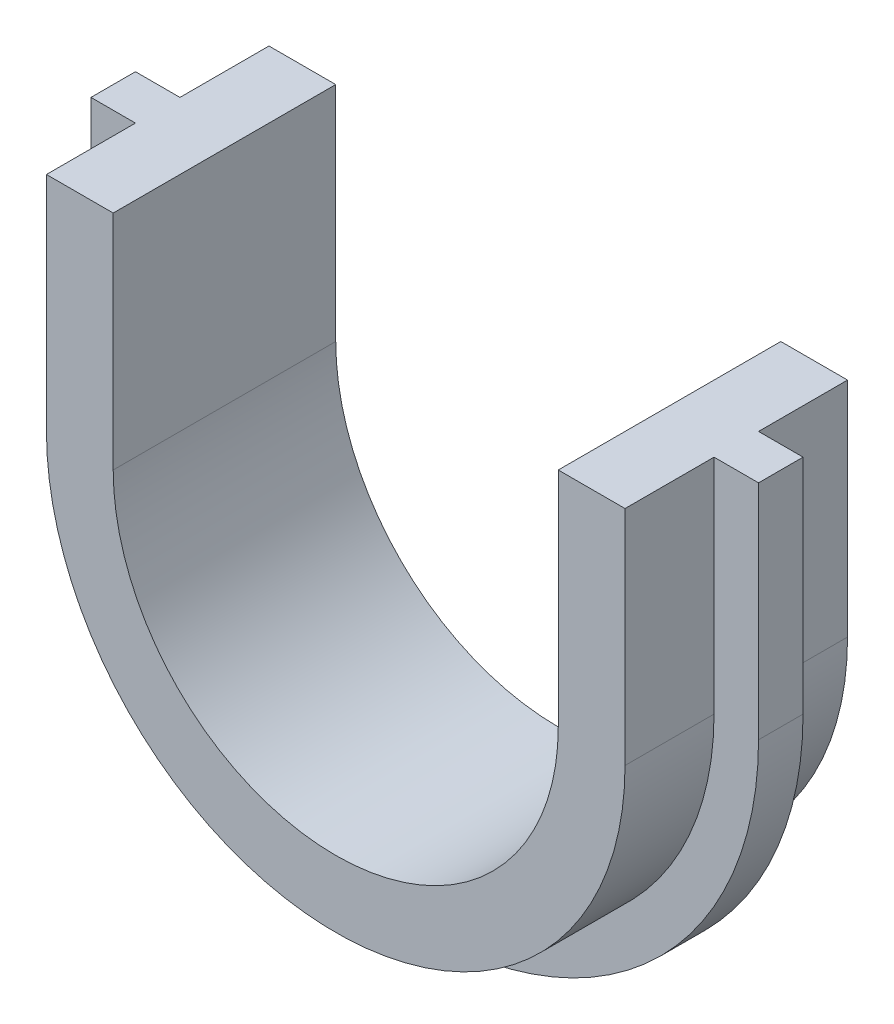
ISO-10303-21;
HEADER;
FILE_DESCRIPTION(('STEP AP214'),'2;1');
FILE_NAME('part.step','',(''),(''),'','','');
FILE_SCHEMA(('AUTOMOTIVE_DESIGN { 1 0 10303 214 1 1 1 1 }'));
ENDSEC;
DATA;
#1=APPLICATION_CONTEXT('core data for automotive mechanical design processes');
#2=APPLICATION_PROTOCOL_DEFINITION('international standard','automotive_design',2000,#1);
#3=PRODUCT_CONTEXT('',#1,'mechanical');
#4=PRODUCT('Part','Part','',(#3));
#5=PRODUCT_RELATED_PRODUCT_CATEGORY('part','',(#4));
#6=PRODUCT_DEFINITION_FORMATION('','',#4);
#7=PRODUCT_DEFINITION_CONTEXT('part definition',#1,'design');
#8=PRODUCT_DEFINITION('design','',#6,#7);
#9=PRODUCT_DEFINITION_SHAPE('','',#8);
#10=(LENGTH_UNIT() NAMED_UNIT(*) SI_UNIT(.MILLI.,.METRE.));
#11=(NAMED_UNIT(*) PLANE_ANGLE_UNIT() SI_UNIT($,.RADIAN.));
#12=(NAMED_UNIT(*) SI_UNIT($,.STERADIAN.) SOLID_ANGLE_UNIT());
#13=UNCERTAINTY_MEASURE_WITH_UNIT(LENGTH_MEASURE(1.E-05),#10,'distance_accuracy_value','');
#14=(GEOMETRIC_REPRESENTATION_CONTEXT(3) GLOBAL_UNCERTAINTY_ASSIGNED_CONTEXT((#13)) GLOBAL_UNIT_ASSIGNED_CONTEXT((#10,
#11,#12)) REPRESENTATION_CONTEXT('',''));
#15=CARTESIAN_POINT('',(0.,0.,0.));
#16=DIRECTION('',(0.,0.,1.));
#17=DIRECTION('',(1.,0.,0.));
#18=AXIS2_PLACEMENT_3D('',#15,#16,#17);
#19=CARTESIAN_POINT('',(0.,23.5,0.));
#20=DIRECTION('',(0.,0.,1.));
#21=DIRECTION('',(1.,0.,0.));
#22=AXIS2_PLACEMENT_3D('',#19,#20,#21);
#23=PLANE('',#22);
#24=CARTESIAN_POINT('',(0.,25.,0.));
#25=DIRECTION('',(0.,0.,1.));
#26=DIRECTION('',(-1.,0.,0.));
#27=AXIS2_PLACEMENT_3D('',#24,#25,#26);
#28=CIRCLE('',#27,13.);
#29=CARTESIAN_POINT('',(-13.,25.,0.));
#30=VERTEX_POINT('',#29);
#31=CARTESIAN_POINT('',(13.,25.,0.));
#32=VERTEX_POINT('',#31);
#33=EDGE_CURVE('E273',#30,#32,#28,.T.);
#34=ORIENTED_EDGE('',*,*,#33,.F.);
#35=DIRECTION('',(0.,1.,0.));
#36=VECTOR('',#35,1.);
#37=CARTESIAN_POINT('',(-13.,25.,0.));
#38=LINE('',#37,#36);
#39=CARTESIAN_POINT('',(-13.,35.,0.));
#40=VERTEX_POINT('',#39);
#41=EDGE_CURVE('E300',#30,#40,#38,.T.);
#42=ORIENTED_EDGE('',*,*,#41,.T.);
#43=DIRECTION('',(1.,0.,0.));
#44=VECTOR('',#43,1.);
#45=CARTESIAN_POINT('',(-13.,35.,0.));
#46=LINE('',#45,#44);
#47=CARTESIAN_POINT('',(-10.,35.,0.));
#48=VERTEX_POINT('',#47);
#49=EDGE_CURVE('E301',#40,#48,#46,.T.);
#50=ORIENTED_EDGE('',*,*,#49,.T.);
#51=DIRECTION('',(0.,-1.,0.));
#52=VECTOR('',#51,1.);
#53=CARTESIAN_POINT('',(-10.,35.,0.));
#54=LINE('',#53,#52);
#55=CARTESIAN_POINT('',(-10.,25.,0.));
#56=VERTEX_POINT('',#55);
#57=EDGE_CURVE('E286',#48,#56,#54,.T.);
#58=ORIENTED_EDGE('',*,*,#57,.T.);
#59=CARTESIAN_POINT('',(0.,25.,0.));
#60=DIRECTION('',(0.,0.,1.));
#61=DIRECTION('',(-1.,0.,0.));
#62=AXIS2_PLACEMENT_3D('',#59,#60,#61);
#63=CIRCLE('',#62,10.);
#64=CARTESIAN_POINT('',(10.,25.,0.));
#65=VERTEX_POINT('',#64);
#66=EDGE_CURVE('E223',#56,#65,#63,.T.);
#67=ORIENTED_EDGE('',*,*,#66,.T.);
#68=DIRECTION('',(0.,-1.,0.));
#69=VECTOR('',#68,1.);
#70=CARTESIAN_POINT('',(10.,35.,0.));
#71=LINE('',#70,#69);
#72=CARTESIAN_POINT('',(10.,35.,0.));
#73=VERTEX_POINT('',#72);
#74=EDGE_CURVE('E323',#73,#65,#71,.T.);
#75=ORIENTED_EDGE('',*,*,#74,.F.);
#76=DIRECTION('',(-1.,0.,0.));
#77=VECTOR('',#76,1.);
#78=CARTESIAN_POINT('',(13.,35.,0.));
#79=LINE('',#78,#77);
#80=CARTESIAN_POINT('',(13.,35.,0.));
#81=VERTEX_POINT('',#80);
#82=EDGE_CURVE('E335',#81,#73,#79,.T.);
#83=ORIENTED_EDGE('',*,*,#82,.F.);
#84=DIRECTION('',(0.,-1.,0.));
#85=VECTOR('',#84,1.);
#86=CARTESIAN_POINT('',(13.,35.,0.));
#87=LINE('',#86,#85);
#88=EDGE_CURVE('E262',#81,#32,#87,.T.);
#89=ORIENTED_EDGE('',*,*,#88,.T.);
#90=EDGE_LOOP('',(#34,#42,#50,#58,#67,#75,#83,#89));
#91=FACE_BOUND('',#90,.T.);
#92=ADVANCED_FACE('F16',(#91),#23,.F.);
#93=CARTESIAN_POINT('',(0.,23.5,10.));
#94=DIRECTION('',(0.,0.,1.));
#95=DIRECTION('',(1.,0.,0.));
#96=AXIS2_PLACEMENT_3D('',#93,#94,#95);
#97=PLANE('',#96);
#98=CARTESIAN_POINT('',(0.,25.,10.));
#99=DIRECTION('',(0.,0.,1.));
#100=DIRECTION('',(-1.,0.,0.));
#101=AXIS2_PLACEMENT_3D('',#98,#99,#100);
#102=CIRCLE('',#101,13.);
#103=CARTESIAN_POINT('',(-13.,25.,10.));
#104=VERTEX_POINT('',#103);
#105=CARTESIAN_POINT('',(13.,25.,10.));
#106=VERTEX_POINT('',#105);
#107=EDGE_CURVE('E10',#104,#106,#102,.T.);
#108=ORIENTED_EDGE('',*,*,#107,.T.);
#109=DIRECTION('',(0.,1.,0.));
#110=VECTOR('',#109,1.);
#111=CARTESIAN_POINT('',(13.,35.,10.));
#112=LINE('',#111,#110);
#113=CARTESIAN_POINT('',(13.,35.,10.));
#114=VERTEX_POINT('',#113);
#115=EDGE_CURVE('E45',#106,#114,#112,.T.);
#116=ORIENTED_EDGE('',*,*,#115,.T.);
#117=DIRECTION('',(-1.,0.,0.));
#118=VECTOR('',#117,1.);
#119=CARTESIAN_POINT('',(13.,35.,10.));
#120=LINE('',#119,#118);
#121=CARTESIAN_POINT('',(10.,35.,10.));
#122=VERTEX_POINT('',#121);
#123=EDGE_CURVE('E336',#114,#122,#120,.T.);
#124=ORIENTED_EDGE('',*,*,#123,.T.);
#125=DIRECTION('',(0.,-1.,0.));
#126=VECTOR('',#125,1.);
#127=CARTESIAN_POINT('',(10.,35.,10.));
#128=LINE('',#127,#126);
#129=CARTESIAN_POINT('',(10.,25.,10.));
#130=VERTEX_POINT('',#129);
#131=EDGE_CURVE('E326',#122,#130,#128,.T.);
#132=ORIENTED_EDGE('',*,*,#131,.T.);
#133=CARTESIAN_POINT('',(0.,25.,10.));
#134=DIRECTION('',(0.,0.,-1.));
#135=DIRECTION('',(-1.,0.,0.));
#136=AXIS2_PLACEMENT_3D('',#133,#134,#135);
#137=CIRCLE('',#136,10.);
#138=CARTESIAN_POINT('',(-10.,25.,10.));
#139=VERTEX_POINT('',#138);
#140=EDGE_CURVE('E222',#130,#139,#137,.T.);
#141=ORIENTED_EDGE('',*,*,#140,.T.);
#142=DIRECTION('',(0.,1.,0.));
#143=VECTOR('',#142,1.);
#144=CARTESIAN_POINT('',(-10.,35.,10.));
#145=LINE('',#144,#143);
#146=CARTESIAN_POINT('',(-10.,35.,10.));
#147=VERTEX_POINT('',#146);
#148=EDGE_CURVE('E309',#139,#147,#145,.T.);
#149=ORIENTED_EDGE('',*,*,#148,.T.);
#150=DIRECTION('',(-1.,0.,0.));
#151=VECTOR('',#150,1.);
#152=CARTESIAN_POINT('',(-13.,35.,10.));
#153=LINE('',#152,#151);
#154=CARTESIAN_POINT('',(-13.,35.,10.));
#155=VERTEX_POINT('',#154);
#156=EDGE_CURVE('E290',#147,#155,#153,.T.);
#157=ORIENTED_EDGE('',*,*,#156,.T.);
#158=DIRECTION('',(0.,-1.,0.));
#159=VECTOR('',#158,1.);
#160=CARTESIAN_POINT('',(-13.,25.,10.));
#161=LINE('',#160,#159);
#162=EDGE_CURVE('E281',#155,#104,#161,.T.);
#163=ORIENTED_EDGE('',*,*,#162,.T.);
#164=EDGE_LOOP('',(#108,#116,#124,#132,#141,#149,#157,#163));
#165=FACE_BOUND('',#164,.T.);
#166=ADVANCED_FACE('F347',(#165),#97,.T.);
#167=CARTESIAN_POINT('',(0.,25.,0.));
#168=DIRECTION('',(0.,0.,1.));
#169=DIRECTION('',(-1.,0.,0.));
#170=AXIS2_PLACEMENT_3D('',#167,#168,#169);
#171=CYLINDRICAL_SURFACE('',#170,13.);
#172=CARTESIAN_POINT('',(0.,25.,6.00000008940697));
#173=DIRECTION('',(0.,0.,1.));
#174=DIRECTION('',(-1.,0.,0.));
#175=AXIS2_PLACEMENT_3D('',#172,#173,#174);
#176=CIRCLE('',#175,13.);
#177=CARTESIAN_POINT('',(-13.0000001937151,25.,6.00000008940697));
#178=VERTEX_POINT('',#177);
#179=CARTESIAN_POINT('',(13.0000001937151,25.,6.00000008940697));
#180=VERTEX_POINT('',#179);
#181=EDGE_CURVE('E208',#178,#180,#176,.T.);
#182=ORIENTED_EDGE('',*,*,#181,.T.);
#183=DIRECTION('',(0.,0.,1.));
#184=VECTOR('',#183,1.);
#185=CARTESIAN_POINT('',(13.,25.,0.));
#186=LINE('',#185,#184);
#187=EDGE_CURVE('E19',#180,#106,#186,.T.);
#188=ORIENTED_EDGE('',*,*,#187,.T.);
#189=ORIENTED_EDGE('',*,*,#107,.F.);
#190=DIRECTION('',(0.,0.,1.));
#191=VECTOR('',#190,1.);
#192=CARTESIAN_POINT('',(-13.,25.,0.));
#193=LINE('',#192,#191);
#194=EDGE_CURVE('E280',#178,#104,#193,.T.);
#195=ORIENTED_EDGE('',*,*,#194,.F.);
#196=EDGE_LOOP('',(#182,#188,#189,#195));
#197=FACE_BOUND('',#196,.T.);
#198=ADVANCED_FACE('F372',(#197),#171,.T.);
#199=CARTESIAN_POINT('',(13.,25.,0.));
#200=DIRECTION('',(1.,0.,0.));
#201=DIRECTION('',(0.,1.,0.));
#202=AXIS2_PLACEMENT_3D('',#199,#200,#201);
#203=PLANE('',#202);
#204=DIRECTION('',(0.,1.,0.));
#205=VECTOR('',#204,1.);
#206=CARTESIAN_POINT('',(13.,30.,6.00000008940697));
#207=LINE('',#206,#205);
#208=CARTESIAN_POINT('',(13.0000001937151,35.,6.00000008940697));
#209=VERTEX_POINT('',#208);
#210=EDGE_CURVE('E202',#180,#209,#207,.T.);
#211=ORIENTED_EDGE('',*,*,#210,.T.);
#212=DIRECTION('',(0.,0.,1.));
#213=VECTOR('',#212,1.);
#214=CARTESIAN_POINT('',(13.,35.,0.));
#215=LINE('',#214,#213);
#216=EDGE_CURVE('E233',#209,#114,#215,.T.);
#217=ORIENTED_EDGE('',*,*,#216,.T.);
#218=ORIENTED_EDGE('',*,*,#115,.F.);
#219=ORIENTED_EDGE('',*,*,#187,.F.);
#220=EDGE_LOOP('',(#211,#217,#218,#219));
#221=FACE_BOUND('',#220,.T.);
#222=ADVANCED_FACE('F343',(#221),#203,.T.);
#223=CARTESIAN_POINT('',(13.,35.,0.));
#224=DIRECTION('',(0.,1.,0.));
#225=DIRECTION('',(1.,0.,0.));
#226=AXIS2_PLACEMENT_3D('',#223,#224,#225);
#227=PLANE('',#226);
#228=ORIENTED_EDGE('',*,*,#82,.T.);
#229=DIRECTION('',(0.,0.,1.));
#230=VECTOR('',#229,1.);
#231=CARTESIAN_POINT('',(10.,35.,0.));
#232=LINE('',#231,#230);
#233=EDGE_CURVE('E328',#73,#122,#232,.T.);
#234=ORIENTED_EDGE('',*,*,#233,.T.);
#235=ORIENTED_EDGE('',*,*,#123,.F.);
#236=ORIENTED_EDGE('',*,*,#216,.F.);
#237=DIRECTION('',(1.,0.,0.));
#238=VECTOR('',#237,1.);
#239=CARTESIAN_POINT('',(13.0000001937151,35.,6.00000008940697));
#240=LINE('',#239,#238);
#241=CARTESIAN_POINT('',(15.0000002235174,35.,6.00000008940697));
#242=VERTEX_POINT('',#241);
#243=EDGE_CURVE('E207',#209,#242,#240,.T.);
#244=ORIENTED_EDGE('',*,*,#243,.T.);
#245=DIRECTION('',(0.,0.,-1.));
#246=VECTOR('',#245,1.);
#247=CARTESIAN_POINT('',(15.0000002235174,35.,6.00000008940697));
#248=LINE('',#247,#246);
#249=CARTESIAN_POINT('',(15.0000002235174,35.,4.00000005960464));
#250=VERTEX_POINT('',#249);
#251=EDGE_CURVE('E190',#242,#250,#248,.T.);
#252=ORIENTED_EDGE('',*,*,#251,.T.);
#253=DIRECTION('',(-1.,0.,0.));
#254=VECTOR('',#253,1.);
#255=CARTESIAN_POINT('',(15.0000002235174,35.,4.00000005960464));
#256=LINE('',#255,#254);
#257=CARTESIAN_POINT('',(13.0000001937151,35.,4.00000005960464));
#258=VERTEX_POINT('',#257);
#259=EDGE_CURVE('E260',#250,#258,#256,.T.);
#260=ORIENTED_EDGE('',*,*,#259,.T.);
#261=DIRECTION('',(0.,0.,1.));
#262=VECTOR('',#261,1.);
#263=CARTESIAN_POINT('',(13.,35.,0.));
#264=LINE('',#263,#262);
#265=EDGE_CURVE('E268',#81,#258,#264,.T.);
#266=ORIENTED_EDGE('',*,*,#265,.F.);
#267=EDGE_LOOP('',(#228,#234,#235,#236,#244,#252,#260,#266));
#268=FACE_BOUND('',#267,.T.);
#269=ADVANCED_FACE('F350',(#268),#227,.T.);
#270=CARTESIAN_POINT('',(10.,35.,0.));
#271=DIRECTION('',(-1.,0.,0.));
#272=DIRECTION('',(0.,0.,1.));
#273=AXIS2_PLACEMENT_3D('',#270,#271,#272);
#274=PLANE('',#273);
#275=ORIENTED_EDGE('',*,*,#74,.T.);
#276=DIRECTION('',(0.,0.,1.));
#277=VECTOR('',#276,1.);
#278=CARTESIAN_POINT('',(10.,25.,0.));
#279=LINE('',#278,#277);
#280=EDGE_CURVE('E221',#65,#130,#279,.T.);
#281=ORIENTED_EDGE('',*,*,#280,.T.);
#282=ORIENTED_EDGE('',*,*,#131,.F.);
#283=ORIENTED_EDGE('',*,*,#233,.F.);
#284=EDGE_LOOP('',(#275,#281,#282,#283));
#285=FACE_BOUND('',#284,.T.);
#286=ADVANCED_FACE('F352',(#285),#274,.T.);
#287=CARTESIAN_POINT('',(0.,25.,0.));
#288=DIRECTION('',(0.,0.,1.));
#289=DIRECTION('',(-1.,0.,0.));
#290=AXIS2_PLACEMENT_3D('',#287,#288,#289);
#291=CYLINDRICAL_SURFACE('',#290,10.);
#292=ORIENTED_EDGE('',*,*,#66,.F.);
#293=DIRECTION('',(0.,0.,1.));
#294=VECTOR('',#293,1.);
#295=CARTESIAN_POINT('',(-10.,25.,0.));
#296=LINE('',#295,#294);
#297=EDGE_CURVE('E311',#56,#139,#296,.T.);
#298=ORIENTED_EDGE('',*,*,#297,.T.);
#299=ORIENTED_EDGE('',*,*,#140,.F.);
#300=ORIENTED_EDGE('',*,*,#280,.F.);
#301=EDGE_LOOP('',(#292,#298,#299,#300));
#302=FACE_BOUND('',#301,.T.);
#303=ADVANCED_FACE('F356',(#302),#291,.F.);
#304=CARTESIAN_POINT('',(-10.,25.,0.));
#305=DIRECTION('',(1.,0.,0.));
#306=DIRECTION('',(0.,1.,0.));
#307=AXIS2_PLACEMENT_3D('',#304,#305,#306);
#308=PLANE('',#307);
#309=ORIENTED_EDGE('',*,*,#57,.F.);
#310=DIRECTION('',(0.,0.,1.));
#311=VECTOR('',#310,1.);
#312=CARTESIAN_POINT('',(-10.,35.,0.));
#313=LINE('',#312,#311);
#314=EDGE_CURVE('E282',#48,#147,#313,.T.);
#315=ORIENTED_EDGE('',*,*,#314,.T.);
#316=ORIENTED_EDGE('',*,*,#148,.F.);
#317=ORIENTED_EDGE('',*,*,#297,.F.);
#318=EDGE_LOOP('',(#309,#315,#316,#317));
#319=FACE_BOUND('',#318,.T.);
#320=ADVANCED_FACE('F359',(#319),#308,.T.);
#321=CARTESIAN_POINT('',(-10.,35.,0.));
#322=DIRECTION('',(0.,1.,0.));
#323=DIRECTION('',(1.,0.,0.));
#324=AXIS2_PLACEMENT_3D('',#321,#322,#323);
#325=PLANE('',#324);
#326=ORIENTED_EDGE('',*,*,#49,.F.);
#327=DIRECTION('',(0.,0.,1.));
#328=VECTOR('',#327,1.);
#329=CARTESIAN_POINT('',(-13.,35.,0.));
#330=LINE('',#329,#328);
#331=CARTESIAN_POINT('',(-13.0000001937151,35.,4.00000005960464));
#332=VERTEX_POINT('',#331);
#333=EDGE_CURVE('E292',#40,#332,#330,.T.);
#334=ORIENTED_EDGE('',*,*,#333,.T.);
#335=DIRECTION('',(1.,0.,0.));
#336=VECTOR('',#335,1.);
#337=CARTESIAN_POINT('',(-15.0000002235174,35.,4.00000005960464));
#338=LINE('',#337,#336);
#339=CARTESIAN_POINT('',(-15.0000002235174,35.,4.00000005960464));
#340=VERTEX_POINT('',#339);
#341=EDGE_CURVE('E241',#340,#332,#338,.T.);
#342=ORIENTED_EDGE('',*,*,#341,.F.);
#343=DIRECTION('',(0.,0.,-1.));
#344=VECTOR('',#343,1.);
#345=CARTESIAN_POINT('',(-15.0000002235174,35.,6.00000008940697));
#346=LINE('',#345,#344);
#347=CARTESIAN_POINT('',(-15.0000002235174,35.,6.00000008940697));
#348=VERTEX_POINT('',#347);
#349=EDGE_CURVE('E178',#348,#340,#346,.T.);
#350=ORIENTED_EDGE('',*,*,#349,.F.);
#351=DIRECTION('',(-1.,0.,0.));
#352=VECTOR('',#351,1.);
#353=CARTESIAN_POINT('',(-13.0000001937151,35.,6.00000008940697));
#354=LINE('',#353,#352);
#355=CARTESIAN_POINT('',(-13.0000001937151,35.,6.00000008940697));
#356=VERTEX_POINT('',#355);
#357=EDGE_CURVE('E213',#356,#348,#354,.T.);
#358=ORIENTED_EDGE('',*,*,#357,.F.);
#359=DIRECTION('',(0.,0.,1.));
#360=VECTOR('',#359,1.);
#361=CARTESIAN_POINT('',(-13.,35.,0.));
#362=LINE('',#361,#360);
#363=EDGE_CURVE('E289',#356,#155,#362,.T.);
#364=ORIENTED_EDGE('',*,*,#363,.T.);
#365=ORIENTED_EDGE('',*,*,#156,.F.);
#366=ORIENTED_EDGE('',*,*,#314,.F.);
#367=EDGE_LOOP('',(#326,#334,#342,#350,#358,#364,#365,#366));
#368=FACE_BOUND('',#367,.T.);
#369=ADVANCED_FACE('F368',(#368),#325,.T.);
#370=CARTESIAN_POINT('',(-13.,35.,0.));
#371=DIRECTION('',(-1.,0.,0.));
#372=DIRECTION('',(0.,0.,1.));
#373=AXIS2_PLACEMENT_3D('',#370,#371,#372);
#374=PLANE('',#373);
#375=DIRECTION('',(0.,1.,0.));
#376=VECTOR('',#375,1.);
#377=CARTESIAN_POINT('',(-13.,35.,4.00000005960464));
#378=LINE('',#377,#376);
#379=CARTESIAN_POINT('',(-13.0000001937151,25.,4.00000005960464));
#380=VERTEX_POINT('',#379);
#381=EDGE_CURVE('E244',#380,#332,#378,.T.);
#382=ORIENTED_EDGE('',*,*,#381,.T.);
#383=ORIENTED_EDGE('',*,*,#333,.F.);
#384=ORIENTED_EDGE('',*,*,#41,.F.);
#385=DIRECTION('',(0.,0.,1.));
#386=VECTOR('',#385,1.);
#387=CARTESIAN_POINT('',(-13.,25.,0.));
#388=LINE('',#387,#386);
#389=EDGE_CURVE('E271',#30,#380,#388,.T.);
#390=ORIENTED_EDGE('',*,*,#389,.T.);
#391=EDGE_LOOP('',(#382,#383,#384,#390));
#392=FACE_BOUND('',#391,.T.);
#393=ADVANCED_FACE('F572',(#392),#374,.T.);
#394=CARTESIAN_POINT('',(-13.,35.,0.));
#395=DIRECTION('',(-1.,0.,0.));
#396=DIRECTION('',(0.,0.,1.));
#397=AXIS2_PLACEMENT_3D('',#394,#395,#396);
#398=PLANE('',#397);
#399=DIRECTION('',(0.,-1.,0.));
#400=VECTOR('',#399,1.);
#401=CARTESIAN_POINT('',(-13.,35.,6.00000008940697));
#402=LINE('',#401,#400);
#403=EDGE_CURVE('E204',#356,#178,#402,.T.);
#404=ORIENTED_EDGE('',*,*,#403,.T.);
#405=ORIENTED_EDGE('',*,*,#194,.T.);
#406=ORIENTED_EDGE('',*,*,#162,.F.);
#407=ORIENTED_EDGE('',*,*,#363,.F.);
#408=EDGE_LOOP('',(#404,#405,#406,#407));
#409=FACE_BOUND('',#408,.T.);
#410=ADVANCED_FACE('F371',(#409),#398,.T.);
#411=CARTESIAN_POINT('',(0.,25.,0.));
#412=DIRECTION('',(0.,0.,1.));
#413=DIRECTION('',(-1.,0.,0.));
#414=AXIS2_PLACEMENT_3D('',#411,#412,#413);
#415=CYLINDRICAL_SURFACE('',#414,13.);
#416=CARTESIAN_POINT('',(0.,25.,4.00000005960464));
#417=DIRECTION('',(0.,0.,-1.));
#418=DIRECTION('',(-1.,0.,0.));
#419=AXIS2_PLACEMENT_3D('',#416,#417,#418);
#420=CIRCLE('',#419,13.);
#421=CARTESIAN_POINT('',(13.0000001937151,25.,4.00000005960464));
#422=VERTEX_POINT('',#421);
#423=EDGE_CURVE('E247',#422,#380,#420,.T.);
#424=ORIENTED_EDGE('',*,*,#423,.T.);
#425=ORIENTED_EDGE('',*,*,#389,.F.);
#426=ORIENTED_EDGE('',*,*,#33,.T.);
#427=DIRECTION('',(0.,0.,1.));
#428=VECTOR('',#427,1.);
#429=CARTESIAN_POINT('',(13.,25.,0.));
#430=LINE('',#429,#428);
#431=EDGE_CURVE('E261',#32,#422,#430,.T.);
#432=ORIENTED_EDGE('',*,*,#431,.T.);
#433=EDGE_LOOP('',(#424,#425,#426,#432));
#434=FACE_BOUND('',#433,.T.);
#435=ADVANCED_FACE('F596',(#434),#415,.T.);
#436=CARTESIAN_POINT('',(13.,25.,0.));
#437=DIRECTION('',(1.,0.,0.));
#438=DIRECTION('',(0.,1.,0.));
#439=AXIS2_PLACEMENT_3D('',#436,#437,#438);
#440=PLANE('',#439);
#441=DIRECTION('',(0.,-1.,0.));
#442=VECTOR('',#441,1.);
#443=CARTESIAN_POINT('',(13.,30.,4.00000005960464));
#444=LINE('',#443,#442);
#445=EDGE_CURVE('E251',#258,#422,#444,.T.);
#446=ORIENTED_EDGE('',*,*,#445,.T.);
#447=ORIENTED_EDGE('',*,*,#431,.F.);
#448=ORIENTED_EDGE('',*,*,#88,.F.);
#449=ORIENTED_EDGE('',*,*,#265,.T.);
#450=EDGE_LOOP('',(#446,#447,#448,#449));
#451=FACE_BOUND('',#450,.T.);
#452=ADVANCED_FACE('F601',(#451),#440,.T.);
#453=CARTESIAN_POINT('',(-15.0000002235174,35.,4.00000005960464));
#454=DIRECTION('',(0.,0.,-1.));
#455=DIRECTION('',(0.,-1.,0.));
#456=AXIS2_PLACEMENT_3D('',#453,#454,#455);
#457=PLANE('',#456);
#458=ORIENTED_EDGE('',*,*,#341,.T.);
#459=ORIENTED_EDGE('',*,*,#381,.F.);
#460=ORIENTED_EDGE('',*,*,#423,.F.);
#461=ORIENTED_EDGE('',*,*,#445,.F.);
#462=ORIENTED_EDGE('',*,*,#259,.F.);
#463=DIRECTION('',(0.,1.,0.));
#464=VECTOR('',#463,1.);
#465=CARTESIAN_POINT('',(15.0000002235174,25.,4.00000005960464));
#466=LINE('',#465,#464);
#467=CARTESIAN_POINT('',(15.0000002235174,25.,4.00000005960464));
#468=VERTEX_POINT('',#467);
#469=EDGE_CURVE('E194',#468,#250,#466,.T.);
#470=ORIENTED_EDGE('',*,*,#469,.F.);
#471=CARTESIAN_POINT('',(0.,25.,4.00000005960464));
#472=DIRECTION('',(0.,0.,1.));
#473=DIRECTION('',(-1.,0.,0.));
#474=AXIS2_PLACEMENT_3D('',#471,#472,#473);
#475=CIRCLE('',#474,15.0000002235174);
#476=CARTESIAN_POINT('',(-15.0000002235174,25.,4.00000005960464));
#477=VERTEX_POINT('',#476);
#478=EDGE_CURVE('E177',#477,#468,#475,.T.);
#479=ORIENTED_EDGE('',*,*,#478,.F.);
#480=DIRECTION('',(0.,-1.,0.));
#481=VECTOR('',#480,1.);
#482=CARTESIAN_POINT('',(-15.0000002235174,35.,4.00000005960464));
#483=LINE('',#482,#481);
#484=EDGE_CURVE('E212',#340,#477,#483,.T.);
#485=ORIENTED_EDGE('',*,*,#484,.F.);
#486=EDGE_LOOP('',(#458,#459,#460,#461,#462,#470,#479,#485));
#487=FACE_BOUND('',#486,.T.);
#488=ADVANCED_FACE('F604',(#487),#457,.T.);
#489=CARTESIAN_POINT('',(-13.0000001937151,35.,6.00000008940697));
#490=DIRECTION('',(0.,0.,1.));
#491=DIRECTION('',(1.,0.,0.));
#492=AXIS2_PLACEMENT_3D('',#489,#490,#491);
#493=PLANE('',#492);
#494=ORIENTED_EDGE('',*,*,#357,.T.);
#495=DIRECTION('',(0.,-1.,0.));
#496=VECTOR('',#495,1.);
#497=CARTESIAN_POINT('',(-15.0000002235174,35.,6.00000008940697));
#498=LINE('',#497,#496);
#499=CARTESIAN_POINT('',(-15.0000002235174,25.,6.00000008940697));
#500=VERTEX_POINT('',#499);
#501=EDGE_CURVE('E172',#348,#500,#498,.T.);
#502=ORIENTED_EDGE('',*,*,#501,.T.);
#503=CARTESIAN_POINT('',(0.,25.,6.00000008940697));
#504=DIRECTION('',(0.,0.,1.));
#505=DIRECTION('',(-1.,0.,0.));
#506=AXIS2_PLACEMENT_3D('',#503,#504,#505);
#507=CIRCLE('',#506,15.0000002235174);
#508=CARTESIAN_POINT('',(15.0000002235174,25.,6.00000008940697));
#509=VERTEX_POINT('',#508);
#510=EDGE_CURVE('E164',#500,#509,#507,.T.);
#511=ORIENTED_EDGE('',*,*,#510,.T.);
#512=DIRECTION('',(0.,1.,0.));
#513=VECTOR('',#512,1.);
#514=CARTESIAN_POINT('',(15.0000002235174,25.,6.00000008940697));
#515=LINE('',#514,#513);
#516=EDGE_CURVE('E166',#509,#242,#515,.T.);
#517=ORIENTED_EDGE('',*,*,#516,.T.);
#518=ORIENTED_EDGE('',*,*,#243,.F.);
#519=ORIENTED_EDGE('',*,*,#210,.F.);
#520=ORIENTED_EDGE('',*,*,#181,.F.);
#521=ORIENTED_EDGE('',*,*,#403,.F.);
#522=EDGE_LOOP('',(#494,#502,#511,#517,#518,#519,#520,#521));
#523=FACE_BOUND('',#522,.T.);
#524=ADVANCED_FACE('F170',(#523),#493,.T.);
#525=CARTESIAN_POINT('',(-15.0000002235174,35.,6.00000008940697));
#526=DIRECTION('',(-1.,0.,0.));
#527=DIRECTION('',(0.,0.,1.));
#528=AXIS2_PLACEMENT_3D('',#525,#526,#527);
#529=PLANE('',#528);
#530=ORIENTED_EDGE('',*,*,#349,.T.);
#531=ORIENTED_EDGE('',*,*,#484,.T.);
#532=DIRECTION('',(0.,0.,-1.));
#533=VECTOR('',#532,1.);
#534=CARTESIAN_POINT('',(-15.0000002235174,25.,6.00000008940697));
#535=LINE('',#534,#533);
#536=EDGE_CURVE('E188',#500,#477,#535,.T.);
#537=ORIENTED_EDGE('',*,*,#536,.F.);
#538=ORIENTED_EDGE('',*,*,#501,.F.);
#539=EDGE_LOOP('',(#530,#531,#537,#538));
#540=FACE_BOUND('',#539,.T.);
#541=ADVANCED_FACE('F621',(#540),#529,.T.);
#542=CARTESIAN_POINT('',(0.,25.,5.00000007450581));
#543=DIRECTION('',(0.,0.,1.));
#544=DIRECTION('',(-1.,0.,0.));
#545=AXIS2_PLACEMENT_3D('',#542,#543,#544);
#546=CYLINDRICAL_SURFACE('',#545,15.0000002235174);
#547=ORIENTED_EDGE('',*,*,#536,.T.);
#548=ORIENTED_EDGE('',*,*,#478,.T.);
#549=DIRECTION('',(0.,0.,-1.));
#550=VECTOR('',#549,1.);
#551=CARTESIAN_POINT('',(15.0000002235174,25.,6.00000008940697));
#552=LINE('',#551,#550);
#553=EDGE_CURVE('E184',#509,#468,#552,.T.);
#554=ORIENTED_EDGE('',*,*,#553,.F.);
#555=ORIENTED_EDGE('',*,*,#510,.F.);
#556=EDGE_LOOP('',(#547,#548,#554,#555));
#557=FACE_BOUND('',#556,.T.);
#558=ADVANCED_FACE('F191',(#557),#546,.T.);
#559=CARTESIAN_POINT('',(15.0000002235174,25.,6.00000008940697));
#560=DIRECTION('',(1.,0.,0.));
#561=DIRECTION('',(0.,1.,0.));
#562=AXIS2_PLACEMENT_3D('',#559,#560,#561);
#563=PLANE('',#562);
#564=ORIENTED_EDGE('',*,*,#553,.T.);
#565=ORIENTED_EDGE('',*,*,#469,.T.);
#566=ORIENTED_EDGE('',*,*,#251,.F.);
#567=ORIENTED_EDGE('',*,*,#516,.F.);
#568=EDGE_LOOP('',(#564,#565,#566,#567));
#569=FACE_BOUND('',#568,.T.);
#570=ADVANCED_FACE('F183',(#569),#563,.T.);
#571=CLOSED_SHELL('',(#92,#166,#198,#222,#269,#286,#303,#320,#369,#393,#410,#435,#452,#488,#524,
#541,#558,#570));
#572=MANIFOLD_SOLID_BREP('B1',#571);
#573=ADVANCED_BREP_SHAPE_REPRESENTATION('',(#18,#572),#14);
#574=SHAPE_DEFINITION_REPRESENTATION(#9,#573);
ENDSEC;
END-ISO-10303-21;
